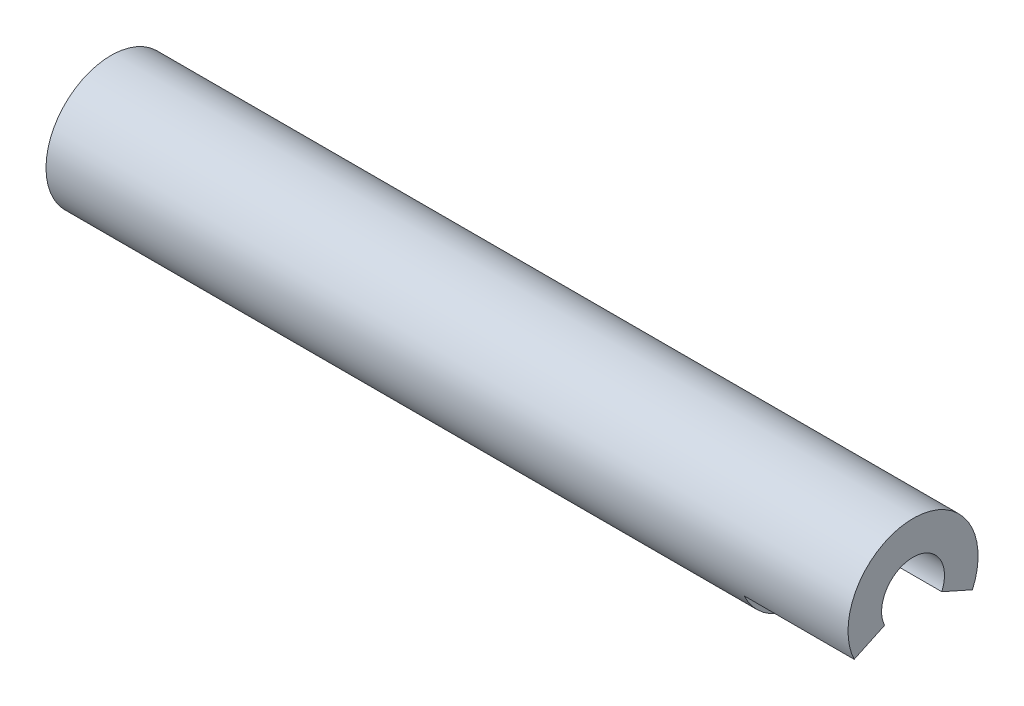
ISO-10303-21;
HEADER;
FILE_DESCRIPTION(('STEP AP214'),'2;1');
FILE_NAME('part.step','',(''),(''),'','','');
FILE_SCHEMA(('AUTOMOTIVE_DESIGN { 1 0 10303 214 1 1 1 1 }'));
ENDSEC;
DATA;
#1=APPLICATION_CONTEXT('core data for automotive mechanical design processes');
#2=APPLICATION_PROTOCOL_DEFINITION('international standard','automotive_design',2000,#1);
#3=PRODUCT_CONTEXT('',#1,'mechanical');
#4=PRODUCT('Part','Part','',(#3));
#5=PRODUCT_RELATED_PRODUCT_CATEGORY('part','',(#4));
#6=PRODUCT_DEFINITION_FORMATION('','',#4);
#7=PRODUCT_DEFINITION_CONTEXT('part definition',#1,'design');
#8=PRODUCT_DEFINITION('design','',#6,#7);
#9=PRODUCT_DEFINITION_SHAPE('','',#8);
#10=(LENGTH_UNIT() NAMED_UNIT(*) SI_UNIT(.MILLI.,.METRE.));
#11=(NAMED_UNIT(*) PLANE_ANGLE_UNIT() SI_UNIT($,.RADIAN.));
#12=(NAMED_UNIT(*) SI_UNIT($,.STERADIAN.) SOLID_ANGLE_UNIT());
#13=UNCERTAINTY_MEASURE_WITH_UNIT(LENGTH_MEASURE(1.E-05),#10,'distance_accuracy_value','');
#14=(GEOMETRIC_REPRESENTATION_CONTEXT(3) GLOBAL_UNCERTAINTY_ASSIGNED_CONTEXT((#13)) GLOBAL_UNIT_ASSIGNED_CONTEXT((#10,
#11,#12)) REPRESENTATION_CONTEXT('',''));
#15=CARTESIAN_POINT('',(0.,0.,0.));
#16=DIRECTION('',(0.,0.,1.));
#17=DIRECTION('',(1.,0.,0.));
#18=AXIS2_PLACEMENT_3D('',#15,#16,#17);
#19=CARTESIAN_POINT('',(153.,0.,0.));
#20=DIRECTION('',(-1.,0.,0.));
#21=DIRECTION('',(0.,0.,1.));
#22=AXIS2_PLACEMENT_3D('',#19,#20,#21);
#23=CYLINDRICAL_SURFACE('',#22,12.4054054054054);
#24=DIRECTION('',(1.,0.,0.));
#25=VECTOR('',#24,1.);
#26=CARTESIAN_POINT('',(132.,-5.05862350539555,-11.327153724706));
#27=LINE('',#26,#25);
#28=CARTESIAN_POINT('',(132.,-5.05862350539555,-11.327153724706));
#29=VERTEX_POINT('',#28);
#30=CARTESIAN_POINT('',(153.,-5.05862350539555,-11.327153724706));
#31=VERTEX_POINT('',#30);
#32=EDGE_CURVE('E95',#29,#31,#27,.T.);
#33=ORIENTED_EDGE('',*,*,#32,.F.);
#34=CARTESIAN_POINT('',(132.,0.,0.));
#35=DIRECTION('',(1.,0.,0.));
#36=DIRECTION('',(0.,0.,1.));
#37=AXIS2_PLACEMENT_3D('',#34,#35,#36);
#38=CIRCLE('',#37,12.4054054054054);
#39=CARTESIAN_POINT('',(132.,-5.26592169031379,11.2322816926902));
#40=VERTEX_POINT('',#39);
#41=EDGE_CURVE('E100',#40,#29,#38,.T.);
#42=ORIENTED_EDGE('',*,*,#41,.F.);
#43=DIRECTION('',(1.,0.,0.));
#44=VECTOR('',#43,1.);
#45=CARTESIAN_POINT('',(132.,-5.26592169031379,11.2322816926902));
#46=LINE('',#45,#44);
#47=CARTESIAN_POINT('',(153.,-5.26592169031379,11.2322816926902));
#48=VERTEX_POINT('',#47);
#49=EDGE_CURVE('E84',#40,#48,#46,.T.);
#50=ORIENTED_EDGE('',*,*,#49,.T.);
#51=CARTESIAN_POINT('',(153.,0.,0.));
#52=DIRECTION('',(-1.,0.,0.));
#53=DIRECTION('',(0.,0.,1.));
#54=AXIS2_PLACEMENT_3D('',#51,#52,#53);
#55=CIRCLE('',#54,12.4054054054054);
#56=EDGE_CURVE('E11',#48,#31,#55,.T.);
#57=ORIENTED_EDGE('',*,*,#56,.T.);
#58=EDGE_LOOP('',(#33,#42,#50,#57));
#59=FACE_BOUND('',#58,.T.);
#60=CARTESIAN_POINT('',(0.,0.,0.));
#61=DIRECTION('',(-1.,0.,0.));
#62=DIRECTION('',(0.,0.,1.));
#63=AXIS2_PLACEMENT_3D('',#60,#61,#62);
#64=CIRCLE('',#63,12.4054054054054);
#65=CARTESIAN_POINT('',(0.,0.,12.4054054054054));
#66=VERTEX_POINT('',#65);
#67=EDGE_CURVE('E49',#66,#66,#64,.T.);
#68=ORIENTED_EDGE('',*,*,#67,.F.);
#69=EDGE_LOOP('',(#68));
#70=FACE_BOUND('',#69,.T.);
#71=ADVANCED_FACE('F41',(#59,#70),#23,.T.);
#72=CARTESIAN_POINT('',(153.,12.4054054054054,0.));
#73=DIRECTION('',(1.,0.,0.));
#74=DIRECTION('',(0.,0.,-1.));
#75=AXIS2_PLACEMENT_3D('',#72,#73,#74);
#76=PLANE('',#75);
#77=DIRECTION('',(0.,0.407775750979598,0.9130821085275));
#78=VECTOR('',#77,1.);
#79=CARTESIAN_POINT('',(153.,-2.44665450587758,-5.478492651165));
#80=LINE('',#79,#78);
#81=CARTESIAN_POINT('',(153.,-2.44665450587758,-5.478492651165));
#82=VERTEX_POINT('',#81);
#83=EDGE_CURVE('E118',#31,#82,#80,.T.);
#84=ORIENTED_EDGE('',*,*,#83,.F.);
#85=ORIENTED_EDGE('',*,*,#56,.F.);
#86=DIRECTION('',(0.,-0.424486062182158,0.90543447195978));
#87=VECTOR('',#86,1.);
#88=CARTESIAN_POINT('',(153.,-2.54691637309295,5.43260683175868));
#89=LINE('',#88,#87);
#90=CARTESIAN_POINT('',(153.,-2.54691637309295,5.43260683175868));
#91=VERTEX_POINT('',#90);
#92=EDGE_CURVE('E90',#91,#48,#89,.T.);
#93=ORIENTED_EDGE('',*,*,#92,.F.);
#94=CARTESIAN_POINT('',(153.,0.,0.));
#95=DIRECTION('',(1.,0.,0.));
#96=DIRECTION('',(0.,0.,-1.));
#97=AXIS2_PLACEMENT_3D('',#94,#95,#96);
#98=CIRCLE('',#97,6.);
#99=EDGE_CURVE('E56',#82,#91,#98,.T.);
#100=ORIENTED_EDGE('',*,*,#99,.F.);
#101=EDGE_LOOP('',(#84,#85,#93,#100));
#102=FACE_BOUND('',#101,.T.);
#103=ADVANCED_FACE('F132',(#102),#76,.T.);
#104=CARTESIAN_POINT('',(0.,0.,0.));
#105=DIRECTION('',(-1.,0.,0.));
#106=DIRECTION('',(0.,0.,1.));
#107=AXIS2_PLACEMENT_3D('',#104,#105,#106);
#108=PLANE('',#107);
#109=CARTESIAN_POINT('',(0.,0.,0.));
#110=DIRECTION('',(-1.,0.,0.));
#111=DIRECTION('',(0.,0.,1.));
#112=AXIS2_PLACEMENT_3D('',#109,#110,#111);
#113=CIRCLE('',#112,6.);
#114=CARTESIAN_POINT('',(0.,0.,6.));
#115=VERTEX_POINT('',#114);
#116=EDGE_CURVE('E167',#115,#115,#113,.T.);
#117=ORIENTED_EDGE('',*,*,#116,.F.);
#118=EDGE_LOOP('',(#117));
#119=FACE_BOUND('',#118,.T.);
#120=ORIENTED_EDGE('',*,*,#67,.T.);
#121=EDGE_LOOP('',(#120));
#122=FACE_BOUND('',#121,.T.);
#123=ADVANCED_FACE('F130',(#119,#122),#108,.T.);
#124=CARTESIAN_POINT('',(132.,0.,0.));
#125=DIRECTION('',(1.,0.,0.));
#126=DIRECTION('',(0.,0.,-1.));
#127=AXIS2_PLACEMENT_3D('',#124,#125,#126);
#128=CYLINDRICAL_SURFACE('',#127,6.);
#129=ORIENTED_EDGE('',*,*,#99,.T.);
#130=DIRECTION('',(1.,0.,0.));
#131=VECTOR('',#130,1.);
#132=CARTESIAN_POINT('',(132.,-2.54691637309295,5.43260683175868));
#133=LINE('',#132,#131);
#134=CARTESIAN_POINT('',(132.,-2.54691637309295,5.43260683175868));
#135=VERTEX_POINT('',#134);
#136=EDGE_CURVE('E79',#135,#91,#133,.T.);
#137=ORIENTED_EDGE('',*,*,#136,.F.);
#138=CARTESIAN_POINT('',(132.,0.,0.));
#139=DIRECTION('',(1.,0.,0.));
#140=DIRECTION('',(0.,0.,-1.));
#141=AXIS2_PLACEMENT_3D('',#138,#139,#140);
#142=CIRCLE('',#141,6.);
#143=CARTESIAN_POINT('',(132.,-2.44665450587758,-5.478492651165));
#144=VERTEX_POINT('',#143);
#145=EDGE_CURVE('E101',#144,#135,#142,.T.);
#146=ORIENTED_EDGE('',*,*,#145,.F.);
#147=DIRECTION('',(1.,0.,0.));
#148=VECTOR('',#147,1.);
#149=CARTESIAN_POINT('',(132.,-2.44665450587758,-5.478492651165));
#150=LINE('',#149,#148);
#151=EDGE_CURVE('E64',#144,#82,#150,.T.);
#152=ORIENTED_EDGE('',*,*,#151,.T.);
#153=EDGE_LOOP('',(#129,#137,#146,#152));
#154=FACE_BOUND('',#153,.T.);
#155=ADVANCED_FACE('F140',(#154),#128,.F.);
#156=CARTESIAN_POINT('',(132.,-2.44665450587758,-5.478492651165));
#157=DIRECTION('',(0.,0.9130821085275,-0.407775750979598));
#158=DIRECTION('',(0.,0.407775750979598,0.9130821085275));
#159=AXIS2_PLACEMENT_3D('',#156,#157,#158);
#160=PLANE('',#159);
#161=ORIENTED_EDGE('',*,*,#83,.T.);
#162=ORIENTED_EDGE('',*,*,#151,.F.);
#163=DIRECTION('',(0.,0.407775750979598,0.9130821085275));
#164=VECTOR('',#163,1.);
#165=CARTESIAN_POINT('',(132.,-2.44665450587758,-5.478492651165));
#166=LINE('',#165,#164);
#167=EDGE_CURVE('E107',#29,#144,#166,.T.);
#168=ORIENTED_EDGE('',*,*,#167,.F.);
#169=ORIENTED_EDGE('',*,*,#32,.T.);
#170=EDGE_LOOP('',(#161,#162,#168,#169));
#171=FACE_BOUND('',#170,.T.);
#172=ADVANCED_FACE('F147',(#171),#160,.F.);
#173=CARTESIAN_POINT('',(132.,-2.54691637309295,5.43260683175868));
#174=DIRECTION('',(0.,0.90543447195978,0.424486062182158));
#175=DIRECTION('',(0.,-0.424486062182158,0.90543447195978));
#176=AXIS2_PLACEMENT_3D('',#173,#174,#175);
#177=PLANE('',#176);
#178=ORIENTED_EDGE('',*,*,#92,.T.);
#179=ORIENTED_EDGE('',*,*,#49,.F.);
#180=DIRECTION('',(0.,-0.424486062182158,0.90543447195978));
#181=VECTOR('',#180,1.);
#182=CARTESIAN_POINT('',(132.,-2.54691637309295,5.43260683175868));
#183=LINE('',#182,#181);
#184=EDGE_CURVE('E87',#135,#40,#183,.T.);
#185=ORIENTED_EDGE('',*,*,#184,.F.);
#186=ORIENTED_EDGE('',*,*,#136,.T.);
#187=EDGE_LOOP('',(#178,#179,#185,#186));
#188=FACE_BOUND('',#187,.T.);
#189=ADVANCED_FACE('F86',(#188),#177,.F.);
#190=CARTESIAN_POINT('',(132.,0.,0.));
#191=DIRECTION('',(1.,0.,0.));
#192=DIRECTION('',(0.,0.,-1.));
#193=AXIS2_PLACEMENT_3D('',#190,#191,#192);
#194=PLANE('',#193);
#195=ORIENTED_EDGE('',*,*,#145,.T.);
#196=ORIENTED_EDGE('',*,*,#184,.T.);
#197=ORIENTED_EDGE('',*,*,#41,.T.);
#198=ORIENTED_EDGE('',*,*,#167,.T.);
#199=EDGE_LOOP('',(#195,#196,#197,#198));
#200=FACE_BOUND('',#199,.T.);
#201=ADVANCED_FACE('F98',(#200),#194,.T.);
#202=CARTESIAN_POINT('',(21.,0.,0.));
#203=DIRECTION('',(-1.,0.,0.));
#204=DIRECTION('',(0.,0.,1.));
#205=AXIS2_PLACEMENT_3D('',#202,#203,#204);
#206=CYLINDRICAL_SURFACE('',#205,6.);
#207=CARTESIAN_POINT('',(21.,0.,0.));
#208=DIRECTION('',(-1.,0.,0.));
#209=DIRECTION('',(0.,0.,1.));
#210=AXIS2_PLACEMENT_3D('',#207,#208,#209);
#211=CIRCLE('',#210,6.);
#212=CARTESIAN_POINT('',(21.,0.,6.));
#213=VERTEX_POINT('',#212);
#214=EDGE_CURVE('E115',#213,#213,#211,.T.);
#215=CARTESIAN_POINT('',(0.,0.,6.));
#216=CARTESIAN_POINT('',(0.21875,0.,6.));
#217=CARTESIAN_POINT('',(0.4375,0.,6.));
#218=CARTESIAN_POINT('',(0.875000000000001,0.,6.));
#219=CARTESIAN_POINT('',(1.09375,0.,6.));
#220=CARTESIAN_POINT('',(1.53125,0.,6.));
#221=CARTESIAN_POINT('',(1.75,0.,6.));
#222=CARTESIAN_POINT('',(2.1875,0.,6.));
#223=CARTESIAN_POINT('',(2.40625,0.,6.));
#224=CARTESIAN_POINT('',(2.84375,0.,6.));
#225=CARTESIAN_POINT('',(3.0625,0.,6.));
#226=CARTESIAN_POINT('',(3.5,0.,6.));
#227=CARTESIAN_POINT('',(3.71875,0.,6.));
#228=CARTESIAN_POINT('',(4.15625,0.,6.));
#229=CARTESIAN_POINT('',(4.375,0.,6.));
#230=CARTESIAN_POINT('',(4.8125,0.,6.));
#231=CARTESIAN_POINT('',(5.03125,0.,6.));
#232=CARTESIAN_POINT('',(5.46875,0.,6.));
#233=CARTESIAN_POINT('',(5.6875,0.,6.));
#234=CARTESIAN_POINT('',(6.125,0.,6.));
#235=CARTESIAN_POINT('',(6.34375,0.,6.));
#236=CARTESIAN_POINT('',(6.78125,0.,6.));
#237=CARTESIAN_POINT('',(7.,0.,6.));
#238=CARTESIAN_POINT('',(7.4375,0.,6.));
#239=CARTESIAN_POINT('',(7.65625,0.,6.));
#240=CARTESIAN_POINT('',(8.09375,0.,6.));
#241=CARTESIAN_POINT('',(8.3125,0.,6.));
#242=CARTESIAN_POINT('',(8.75,0.,6.));
#243=CARTESIAN_POINT('',(8.96875,0.,6.));
#244=CARTESIAN_POINT('',(9.40625,0.,6.));
#245=CARTESIAN_POINT('',(9.625,0.,6.));
#246=CARTESIAN_POINT('',(10.0625,0.,6.));
#247=CARTESIAN_POINT('',(10.28125,0.,6.));
#248=CARTESIAN_POINT('',(10.71875,0.,6.));
#249=CARTESIAN_POINT('',(10.9375,0.,6.));
#250=CARTESIAN_POINT('',(11.375,0.,6.));
#251=CARTESIAN_POINT('',(11.59375,0.,6.));
#252=CARTESIAN_POINT('',(12.03125,0.,6.));
#253=CARTESIAN_POINT('',(12.25,0.,6.));
#254=CARTESIAN_POINT('',(12.6875,0.,6.));
#255=CARTESIAN_POINT('',(12.90625,0.,6.));
#256=CARTESIAN_POINT('',(13.34375,0.,6.));
#257=CARTESIAN_POINT('',(13.5625,0.,6.));
#258=CARTESIAN_POINT('',(14.,0.,6.));
#259=CARTESIAN_POINT('',(14.21875,0.,6.));
#260=CARTESIAN_POINT('',(14.65625,0.,6.));
#261=CARTESIAN_POINT('',(14.875,0.,6.));
#262=CARTESIAN_POINT('',(15.3125,0.,6.));
#263=CARTESIAN_POINT('',(15.53125,0.,6.));
#264=CARTESIAN_POINT('',(15.96875,0.,6.));
#265=CARTESIAN_POINT('',(16.1875,0.,6.));
#266=CARTESIAN_POINT('',(16.625,0.,6.));
#267=CARTESIAN_POINT('',(16.84375,0.,6.));
#268=CARTESIAN_POINT('',(17.28125,0.,6.));
#269=CARTESIAN_POINT('',(17.5,0.,6.));
#270=CARTESIAN_POINT('',(17.9375,0.,6.));
#271=CARTESIAN_POINT('',(18.15625,0.,6.));
#272=CARTESIAN_POINT('',(18.59375,0.,6.));
#273=CARTESIAN_POINT('',(18.8125,0.,6.));
#274=CARTESIAN_POINT('',(19.25,0.,6.));
#275=CARTESIAN_POINT('',(19.46875,0.,6.));
#276=CARTESIAN_POINT('',(19.90625,0.,6.));
#277=CARTESIAN_POINT('',(20.125,0.,6.));
#278=CARTESIAN_POINT('',(20.5625,0.,6.));
#279=CARTESIAN_POINT('',(20.78125,0.,6.));
#280=CARTESIAN_POINT('',(21.,0.,6.));
#281=B_SPLINE_CURVE_WITH_KNOTS('',3,(#215,#216,#217,#218,#219,#220,#221,#222,#223,#224,#225,
#226,#227,#228,#229,#230,#231,#232,#233,#234,#235,#236,#237,#238,#239,#240,#241,#242,#243,#244,
#245,#246,#247,#248,#249,#250,#251,#252,#253,#254,#255,#256,#257,#258,#259,#260,#261,#262,#263,
#264,#265,#266,#267,#268,#269,#270,#271,#272,#273,#274,#275,#276,#277,#278,#279,#280),
.UNSPECIFIED.,.F.,.F.,(4,2,2,2,2,2,2,2,2,2,2,2,2,2,2,2,2,2,2,2,2,2,2,2,2,2,2,2,2,2,2,2,4),(0.,
0.656250000000001,1.3125,1.96875,2.625,3.28125,3.9375,4.59375,5.25,5.90625,6.5625,7.21875,7.875,
8.53125,9.1875,9.84375,10.5,11.15625,11.8125,12.46875,13.125,13.78125,14.4375,15.09375,15.75,
16.40625,17.0625,17.71875,18.375,19.03125,19.6875,20.34375,21.),.UNSPECIFIED.);
#282=EDGE_CURVE('BSEAM154',#115,#213,#281,.T.);
#283=ORIENTED_EDGE('',*,*,#116,.T.);
#284=ORIENTED_EDGE('',*,*,#214,.F.);
#285=ORIENTED_EDGE('',*,*,#282,.T.);
#286=ORIENTED_EDGE('',*,*,#282,.F.);
#287=EDGE_LOOP('',(#283,#285,#284,#286));
#288=FACE_BOUND('',#287,.T.);
#289=ADVANCED_FACE('F154',(#288),#206,.F.);
#290=CARTESIAN_POINT('',(21.,0.,0.));
#291=DIRECTION('',(-1.,0.,0.));
#292=DIRECTION('',(0.,0.,1.));
#293=AXIS2_PLACEMENT_3D('',#290,#291,#292);
#294=PLANE('',#293);
#295=ORIENTED_EDGE('',*,*,#214,.T.);
#296=EDGE_LOOP('',(#295));
#297=FACE_BOUND('',#296,.T.);
#298=ADVANCED_FACE('F157',(#297),#294,.T.);
#299=CLOSED_SHELL('',(#71,#103,#123,#155,#172,#189,#201,#289,#298));
#300=MANIFOLD_SOLID_BREP('B2',#299);
#301=ADVANCED_BREP_SHAPE_REPRESENTATION('',(#18,#300),#14);
#302=SHAPE_DEFINITION_REPRESENTATION(#9,#301);
ENDSEC;
END-ISO-10303-21;
